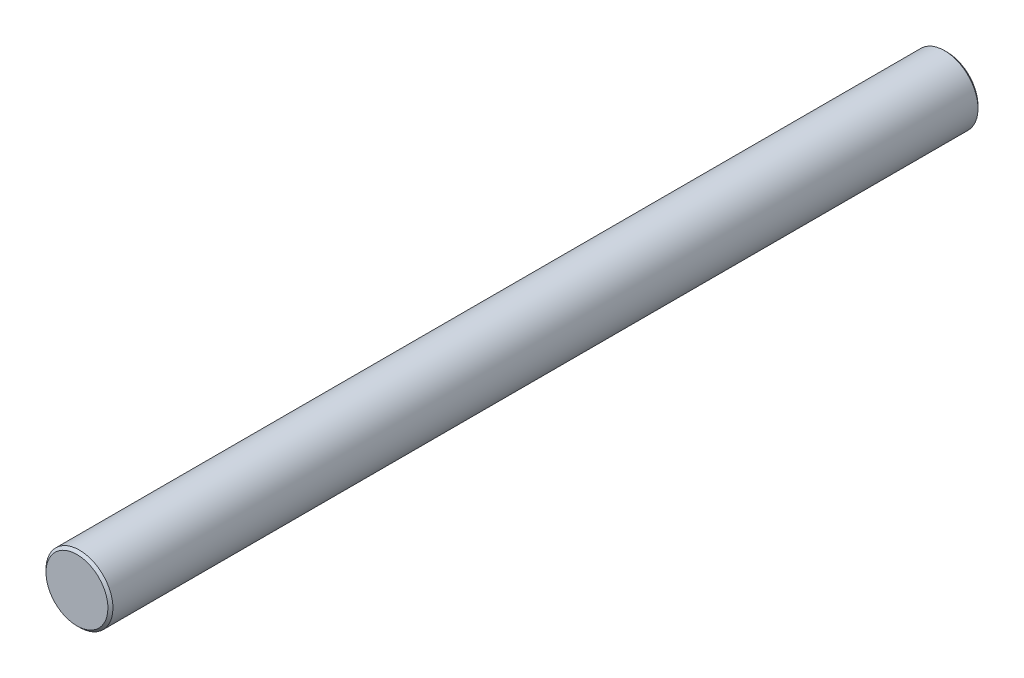
ISO-10303-21;
HEADER;
FILE_DESCRIPTION(('STEP AP214'),'2;1');
FILE_NAME('part.step','',(''),(''),'','','');
FILE_SCHEMA(('AUTOMOTIVE_DESIGN { 1 0 10303 214 1 1 1 1 }'));
ENDSEC;
DATA;
#1=APPLICATION_CONTEXT('core data for automotive mechanical design processes');
#2=APPLICATION_PROTOCOL_DEFINITION('international standard','automotive_design',2000,#1);
#3=PRODUCT_CONTEXT('',#1,'mechanical');
#4=PRODUCT('Part','Part','',(#3));
#5=PRODUCT_RELATED_PRODUCT_CATEGORY('part','',(#4));
#6=PRODUCT_DEFINITION_FORMATION('','',#4);
#7=PRODUCT_DEFINITION_CONTEXT('part definition',#1,'design');
#8=PRODUCT_DEFINITION('design','',#6,#7);
#9=PRODUCT_DEFINITION_SHAPE('','',#8);
#10=(LENGTH_UNIT() NAMED_UNIT(*) SI_UNIT(.MILLI.,.METRE.));
#11=(NAMED_UNIT(*) PLANE_ANGLE_UNIT() SI_UNIT($,.RADIAN.));
#12=(NAMED_UNIT(*) SI_UNIT($,.STERADIAN.) SOLID_ANGLE_UNIT());
#13=UNCERTAINTY_MEASURE_WITH_UNIT(LENGTH_MEASURE(1.E-05),#10,'distance_accuracy_value','');
#14=(GEOMETRIC_REPRESENTATION_CONTEXT(3) GLOBAL_UNCERTAINTY_ASSIGNED_CONTEXT((#13)) GLOBAL_UNIT_ASSIGNED_CONTEXT((#10,
#11,#12)) REPRESENTATION_CONTEXT('',''));
#15=CARTESIAN_POINT('',(0.,0.,0.));
#16=DIRECTION('',(0.,0.,1.));
#17=DIRECTION('',(1.,0.,0.));
#18=AXIS2_PLACEMENT_3D('',#15,#16,#17);
#19=CARTESIAN_POINT('',(0.,9.25,0.));
#20=DIRECTION('',(0.,0.,-1.));
#21=DIRECTION('',(0.,1.,0.));
#22=AXIS2_PLACEMENT_3D('',#19,#20,#21);
#23=PLANE('',#22);
#24=CARTESIAN_POINT('',(0.,0.,0.));
#25=DIRECTION('',(0.,0.,-1.));
#26=DIRECTION('',(0.,1.,0.));
#27=AXIS2_PLACEMENT_3D('',#24,#25,#26);
#28=CIRCLE('',#27,18.5);
#29=CARTESIAN_POINT('',(0.,18.5,0.));
#30=VERTEX_POINT('',#29);
#31=EDGE_CURVE('E9',#30,#30,#28,.T.);
#32=ORIENTED_EDGE('',*,*,#31,.T.);
#33=EDGE_LOOP('',(#32));
#34=FACE_BOUND('',#33,.T.);
#35=CARTESIAN_POINT('',(0.,0.,0.));
#36=DIRECTION('',(0.,0.,1.));
#37=DIRECTION('',(-1.,0.,0.));
#38=AXIS2_PLACEMENT_3D('',#35,#36,#37);
#39=CIRCLE('',#38,6.);
#40=CARTESIAN_POINT('',(-6.,0.,0.));
#41=VERTEX_POINT('',#40);
#42=EDGE_CURVE('E52',#41,#41,#39,.T.);
#43=ORIENTED_EDGE('',*,*,#42,.T.);
#44=EDGE_LOOP('',(#43));
#45=FACE_BOUND('',#44,.T.);
#46=ADVANCED_FACE('F15',(#34,#45),#23,.T.);
#47=CARTESIAN_POINT('',(0.,0.,0.75));
#48=DIRECTION('',(0.,0.,1.));
#49=DIRECTION('',(0.,1.,0.));
#50=AXIS2_PLACEMENT_3D('',#47,#48,#49);
#51=CONICAL_SURFACE('',#50,19.25,0.785398163397448);
#52=CARTESIAN_POINT('',(0.,0.,1.5));
#53=DIRECTION('',(0.,0.,-1.));
#54=DIRECTION('',(0.,1.,0.));
#55=AXIS2_PLACEMENT_3D('',#52,#53,#54);
#56=CIRCLE('',#55,20.);
#57=CARTESIAN_POINT('',(0.,20.,1.5));
#58=VERTEX_POINT('',#57);
#59=EDGE_CURVE('E25',#58,#58,#56,.T.);
#60=ORIENTED_EDGE('',*,*,#59,.T.);
#61=EDGE_LOOP('',(#60));
#62=FACE_BOUND('',#61,.T.);
#63=ORIENTED_EDGE('',*,*,#31,.F.);
#64=EDGE_LOOP('',(#63));
#65=FACE_BOUND('',#64,.T.);
#66=ADVANCED_FACE('F121',(#62,#65),#51,.T.);
#67=CARTESIAN_POINT('',(0.,0.,260.));
#68=DIRECTION('',(0.,0.,1.));
#69=DIRECTION('',(0.,1.,0.));
#70=AXIS2_PLACEMENT_3D('',#67,#68,#69);
#71=CYLINDRICAL_SURFACE('',#70,20.);
#72=CARTESIAN_POINT('',(0.,0.,518.5));
#73=DIRECTION('',(0.,0.,-1.));
#74=DIRECTION('',(0.,1.,0.));
#75=AXIS2_PLACEMENT_3D('',#72,#73,#74);
#76=CIRCLE('',#75,20.);
#77=CARTESIAN_POINT('',(0.,20.,518.5));
#78=VERTEX_POINT('',#77);
#79=EDGE_CURVE('E19',#78,#78,#76,.T.);
#80=ORIENTED_EDGE('',*,*,#79,.T.);
#81=EDGE_LOOP('',(#80));
#82=FACE_BOUND('',#81,.T.);
#83=ORIENTED_EDGE('',*,*,#59,.F.);
#84=EDGE_LOOP('',(#83));
#85=FACE_BOUND('',#84,.T.);
#86=CARTESIAN_POINT('',(0.,0.,6.5));
#87=DIRECTION('',(0.,0.,-1.));
#88=DIRECTION('',(0.,1.,0.));
#89=AXIS2_PLACEMENT_3D('',#86,#87,#88);
#90=CIRCLE('',#89,20.);
#91=CARTESIAN_POINT('',(10.5356537528527,-17.,6.5));
#92=VERTEX_POINT('',#91);
#93=CARTESIAN_POINT('',(-10.5356537528527,-17.,6.5));
#94=VERTEX_POINT('',#93);
#95=EDGE_CURVE('E69',#92,#94,#90,.T.);
#96=ORIENTED_EDGE('',*,*,#95,.T.);
#97=DIRECTION('',(0.,0.,1.));
#98=VECTOR('',#97,1.);
#99=CARTESIAN_POINT('',(-10.5356537528527,-17.,8.25));
#100=LINE('',#99,#98);
#101=CARTESIAN_POINT('',(-10.5356537528527,-17.,10.));
#102=VERTEX_POINT('',#101);
#103=EDGE_CURVE('E62',#94,#102,#100,.T.);
#104=ORIENTED_EDGE('',*,*,#103,.T.);
#105=CARTESIAN_POINT('',(0.,0.,10.));
#106=DIRECTION('',(0.,0.,1.));
#107=DIRECTION('',(0.,1.,0.));
#108=AXIS2_PLACEMENT_3D('',#105,#106,#107);
#109=CIRCLE('',#108,20.);
#110=CARTESIAN_POINT('',(10.5356537528527,-17.,10.));
#111=VERTEX_POINT('',#110);
#112=EDGE_CURVE('E75',#102,#111,#109,.T.);
#113=ORIENTED_EDGE('',*,*,#112,.T.);
#114=DIRECTION('',(0.,0.,-1.));
#115=VECTOR('',#114,1.);
#116=CARTESIAN_POINT('',(10.5356537528527,-17.,8.25));
#117=LINE('',#116,#115);
#118=EDGE_CURVE('E60',#111,#92,#117,.T.);
#119=ORIENTED_EDGE('',*,*,#118,.T.);
#120=EDGE_LOOP('',(#96,#104,#113,#119));
#121=FACE_BOUND('',#120,.T.);
#122=ADVANCED_FACE('F17',(#82,#85,#121),#71,.T.);
#123=CARTESIAN_POINT('',(0.,0.,519.25));
#124=DIRECTION('',(0.,0.,-1.));
#125=DIRECTION('',(0.,1.,0.));
#126=AXIS2_PLACEMENT_3D('',#123,#124,#125);
#127=CONICAL_SURFACE('',#126,19.25,0.785398163397448);
#128=CARTESIAN_POINT('',(0.,0.,520.));
#129=DIRECTION('',(0.,0.,-1.));
#130=DIRECTION('',(0.,1.,0.));
#131=AXIS2_PLACEMENT_3D('',#128,#129,#130);
#132=CIRCLE('',#131,18.5);
#133=CARTESIAN_POINT('',(0.,18.5,520.));
#134=VERTEX_POINT('',#133);
#135=EDGE_CURVE('E44',#134,#134,#132,.T.);
#136=ORIENTED_EDGE('',*,*,#135,.T.);
#137=EDGE_LOOP('',(#136));
#138=FACE_BOUND('',#137,.T.);
#139=ORIENTED_EDGE('',*,*,#79,.F.);
#140=EDGE_LOOP('',(#139));
#141=FACE_BOUND('',#140,.T.);
#142=ADVANCED_FACE('F116',(#138,#141),#127,.T.);
#143=CARTESIAN_POINT('',(0.,9.25,520.));
#144=DIRECTION('',(0.,0.,1.));
#145=DIRECTION('',(0.,-1.,0.));
#146=AXIS2_PLACEMENT_3D('',#143,#144,#145);
#147=PLANE('',#146);
#148=ORIENTED_EDGE('',*,*,#135,.F.);
#149=EDGE_LOOP('',(#148));
#150=FACE_BOUND('',#149,.T.);
#151=ADVANCED_FACE('F110',(#150),#147,.T.);
#152=CARTESIAN_POINT('',(0.,0.,26.4586213285198));
#153=DIRECTION('',(0.,0.,-1.));
#154=DIRECTION('',(-1.,0.,0.));
#155=AXIS2_PLACEMENT_3D('',#152,#153,#154);
#156=CONICAL_SURFACE('',#155,2.52640625,1.0471975511966);
#157=CARTESIAN_POINT('',(0.,0.,25.));
#158=DIRECTION('',(0.,0.,1.));
#159=DIRECTION('',(-1.,0.,0.));
#160=AXIS2_PLACEMENT_3D('',#157,#158,#159);
#161=CIRCLE('',#160,5.0528125);
#162=CARTESIAN_POINT('',(-5.0528125,0.,25.));
#163=VERTEX_POINT('',#162);
#164=EDGE_CURVE('E51',#163,#163,#161,.T.);
#165=ORIENTED_EDGE('',*,*,#164,.F.);
#166=EDGE_LOOP('',(#165));
#167=FACE_BOUND('',#166,.T.);
#168=CARTESIAN_POINT('',(0.,0.,27.9172426570397));
#169=VERTEX_POINT('',#168);
#170=VERTEX_LOOP('',#169);
#171=FACE_BOUND('',#170,.T.);
#172=ADVANCED_FACE('F104',(#167,#171),#156,.F.);
#173=CARTESIAN_POINT('',(0.,0.,12.97359375));
#174=DIRECTION('',(0.,0.,-1.));
#175=DIRECTION('',(-1.,0.,0.));
#176=AXIS2_PLACEMENT_3D('',#173,#174,#175);
#177=CYLINDRICAL_SURFACE('',#176,5.0528125);
#178=CARTESIAN_POINT('',(0.,0.,0.9471875));
#179=DIRECTION('',(0.,0.,1.));
#180=DIRECTION('',(-1.,0.,0.));
#181=AXIS2_PLACEMENT_3D('',#178,#179,#180);
#182=CIRCLE('',#181,5.0528125);
#183=CARTESIAN_POINT('',(-5.0528125,0.,0.9471875));
#184=VERTEX_POINT('',#183);
#185=EDGE_CURVE('E57',#184,#184,#182,.T.);
#186=ORIENTED_EDGE('',*,*,#185,.F.);
#187=EDGE_LOOP('',(#186));
#188=FACE_BOUND('',#187,.T.);
#189=ORIENTED_EDGE('',*,*,#164,.T.);
#190=EDGE_LOOP('',(#189));
#191=FACE_BOUND('',#190,.T.);
#192=ADVANCED_FACE('F101',(#188,#191),#177,.F.);
#193=CARTESIAN_POINT('',(0.,0.,0.47359375));
#194=DIRECTION('',(0.,0.,-1.));
#195=DIRECTION('',(-1.,0.,0.));
#196=AXIS2_PLACEMENT_3D('',#193,#194,#195);
#197=CONICAL_SURFACE('',#196,5.52640625,0.785398163397448);
#198=ORIENTED_EDGE('',*,*,#42,.F.);
#199=EDGE_LOOP('',(#198));
#200=FACE_BOUND('',#199,.T.);
#201=ORIENTED_EDGE('',*,*,#185,.T.);
#202=EDGE_LOOP('',(#201));
#203=FACE_BOUND('',#202,.T.);
#204=ADVANCED_FACE('F99',(#200,#203),#197,.F.);
#205=CARTESIAN_POINT('',(0.,-17.,8.25));
#206=DIRECTION('',(0.,-1.,0.));
#207=DIRECTION('',(0.,0.,-1.));
#208=AXIS2_PLACEMENT_3D('',#205,#206,#207);
#209=PLANE('',#208);
#210=ORIENTED_EDGE('',*,*,#103,.F.);
#211=DIRECTION('',(1.,0.,0.));
#212=VECTOR('',#211,1.);
#213=CARTESIAN_POINT('',(0.,-17.,6.5));
#214=LINE('',#213,#212);
#215=EDGE_CURVE('E66',#94,#92,#214,.T.);
#216=ORIENTED_EDGE('',*,*,#215,.T.);
#217=ORIENTED_EDGE('',*,*,#118,.F.);
#218=DIRECTION('',(-1.,0.,0.));
#219=VECTOR('',#218,1.);
#220=CARTESIAN_POINT('',(0.,-17.,10.));
#221=LINE('',#220,#219);
#222=EDGE_CURVE('E72',#111,#102,#221,.T.);
#223=ORIENTED_EDGE('',*,*,#222,.T.);
#224=EDGE_LOOP('',(#210,#216,#217,#223));
#225=FACE_BOUND('',#224,.T.);
#226=ADVANCED_FACE('F131',(#225),#209,.T.);
#227=CARTESIAN_POINT('',(0.,-19.5,6.5));
#228=DIRECTION('',(0.,0.,1.));
#229=DIRECTION('',(1.,0.,0.));
#230=AXIS2_PLACEMENT_3D('',#227,#228,#229);
#231=PLANE('',#230);
#232=ORIENTED_EDGE('',*,*,#95,.F.);
#233=ORIENTED_EDGE('',*,*,#215,.F.);
#234=EDGE_LOOP('',(#232,#233));
#235=FACE_BOUND('',#234,.T.);
#236=ADVANCED_FACE('F135',(#235),#231,.T.);
#237=CARTESIAN_POINT('',(0.,-19.5,10.));
#238=DIRECTION('',(0.,0.,1.));
#239=DIRECTION('',(1.,0.,0.));
#240=AXIS2_PLACEMENT_3D('',#237,#238,#239);
#241=PLANE('',#240);
#242=ORIENTED_EDGE('',*,*,#112,.F.);
#243=ORIENTED_EDGE('',*,*,#222,.F.);
#244=EDGE_LOOP('',(#242,#243));
#245=FACE_BOUND('',#244,.T.);
#246=ADVANCED_FACE('F87',(#245),#241,.F.);
#247=CLOSED_SHELL('',(#46,#66,#122,#142,#151,#172,#192,#204,#226,#236,#246));
#248=MANIFOLD_SOLID_BREP('B1',#247);
#249=ADVANCED_BREP_SHAPE_REPRESENTATION('',(#18,#248),#14);
#250=SHAPE_DEFINITION_REPRESENTATION(#9,#249);
ENDSEC;
END-ISO-10303-21;
